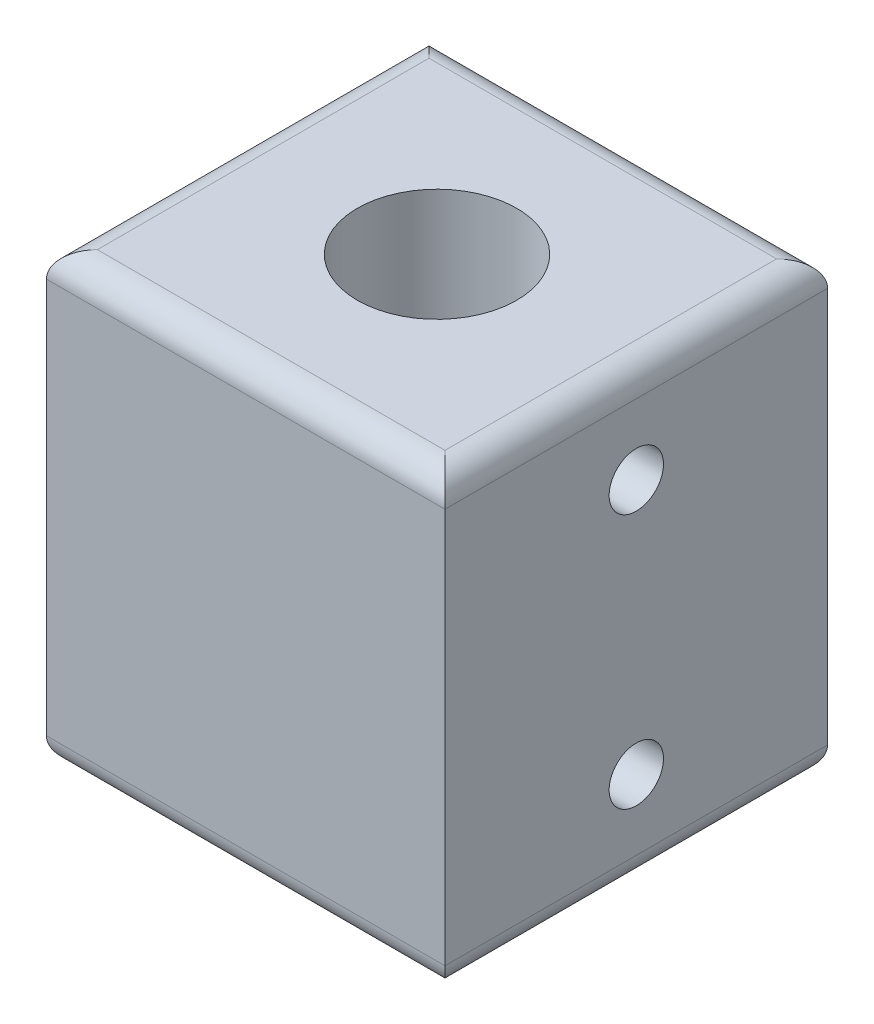
ISO-10303-21;
HEADER;
FILE_DESCRIPTION(('STEP AP214'),'2;1');
FILE_NAME('part.step','',(''),(''),'','','');
FILE_SCHEMA(('AUTOMOTIVE_DESIGN { 1 0 10303 214 1 1 1 1 }'));
ENDSEC;
DATA;
#1=APPLICATION_CONTEXT('core data for automotive mechanical design processes');
#2=APPLICATION_PROTOCOL_DEFINITION('international standard','automotive_design',2000,#1);
#3=PRODUCT_CONTEXT('',#1,'mechanical');
#4=PRODUCT('Part','Part','',(#3));
#5=PRODUCT_RELATED_PRODUCT_CATEGORY('part','',(#4));
#6=PRODUCT_DEFINITION_FORMATION('','',#4);
#7=PRODUCT_DEFINITION_CONTEXT('part definition',#1,'design');
#8=PRODUCT_DEFINITION('design','',#6,#7);
#9=PRODUCT_DEFINITION_SHAPE('','',#8);
#10=(LENGTH_UNIT() NAMED_UNIT(*) SI_UNIT(.MILLI.,.METRE.));
#11=(NAMED_UNIT(*) PLANE_ANGLE_UNIT() SI_UNIT($,.RADIAN.));
#12=(NAMED_UNIT(*) SI_UNIT($,.STERADIAN.) SOLID_ANGLE_UNIT());
#13=UNCERTAINTY_MEASURE_WITH_UNIT(LENGTH_MEASURE(1.E-05),#10,'distance_accuracy_value','');
#14=(GEOMETRIC_REPRESENTATION_CONTEXT(3) GLOBAL_UNCERTAINTY_ASSIGNED_CONTEXT((#13)) GLOBAL_UNIT_ASSIGNED_CONTEXT((#10,
#11,#12)) REPRESENTATION_CONTEXT('',''));
#15=CARTESIAN_POINT('',(0.,0.,0.));
#16=DIRECTION('',(0.,0.,1.));
#17=DIRECTION('',(1.,0.,0.));
#18=AXIS2_PLACEMENT_3D('',#15,#16,#17);
#19=CARTESIAN_POINT('',(0.,0.,19.05));
#20=DIRECTION('',(1.,0.,0.));
#21=DIRECTION('',(0.,0.,-1.));
#22=AXIS2_PLACEMENT_3D('',#19,#20,#21);
#23=PLANE('',#22);
#24=CARTESIAN_POINT('',(0.,17.4625,9.525));
#25=DIRECTION('',(-1.,0.,0.));
#26=DIRECTION('',(0.,0.,1.));
#27=AXIS2_PLACEMENT_3D('',#24,#25,#26);
#28=CIRCLE('',#27,1.35255);
#29=CARTESIAN_POINT('',(0.,17.4625,10.87755));
#30=VERTEX_POINT('',#29);
#31=EDGE_CURVE('E144',#30,#30,#28,.T.);
#32=ORIENTED_EDGE('',*,*,#31,.F.);
#33=EDGE_LOOP('',(#32));
#34=FACE_BOUND('',#33,.T.);
#35=CARTESIAN_POINT('',(0.,4.7625,9.525));
#36=DIRECTION('',(-1.,0.,0.));
#37=DIRECTION('',(0.,0.,1.));
#38=AXIS2_PLACEMENT_3D('',#35,#36,#37);
#39=CIRCLE('',#38,1.35255);
#40=CARTESIAN_POINT('',(0.,4.7625,10.87755));
#41=VERTEX_POINT('',#40);
#42=EDGE_CURVE('E150',#41,#41,#39,.T.);
#43=ORIENTED_EDGE('',*,*,#42,.F.);
#44=EDGE_LOOP('',(#43));
#45=FACE_BOUND('',#44,.T.);
#46=DIRECTION('',(0.,-1.,0.));
#47=VECTOR('',#46,1.);
#48=CARTESIAN_POINT('',(0.,0.,0.));
#49=LINE('',#48,#47);
#50=CARTESIAN_POINT('',(0.,20.955,0.));
#51=VERTEX_POINT('',#50);
#52=CARTESIAN_POINT('',(0.,1.27,0.));
#53=VERTEX_POINT('',#52);
#54=EDGE_CURVE('E160',#51,#53,#49,.T.);
#55=ORIENTED_EDGE('',*,*,#54,.T.);
#56=DIRECTION('',(0.,0.,-1.));
#57=VECTOR('',#56,1.);
#58=CARTESIAN_POINT('',(0.,1.27,19.05));
#59=LINE('',#58,#57);
#60=CARTESIAN_POINT('',(0.,1.27,19.05));
#61=VERTEX_POINT('',#60);
#62=EDGE_CURVE('E199',#53,#61,#59,.F.);
#63=ORIENTED_EDGE('',*,*,#62,.T.);
#64=DIRECTION('',(0.,-1.,0.));
#65=VECTOR('',#64,1.);
#66=CARTESIAN_POINT('',(0.,0.,19.05));
#67=LINE('',#66,#65);
#68=CARTESIAN_POINT('',(0.,20.955,19.05));
#69=VERTEX_POINT('',#68);
#70=EDGE_CURVE('E163',#69,#61,#67,.T.);
#71=ORIENTED_EDGE('',*,*,#70,.F.);
#72=DIRECTION('',(0.,0.,-1.));
#73=VECTOR('',#72,1.);
#74=CARTESIAN_POINT('',(0.,20.955,19.05));
#75=LINE('',#74,#73);
#76=EDGE_CURVE('E197',#69,#51,#75,.T.);
#77=ORIENTED_EDGE('',*,*,#76,.T.);
#78=EDGE_LOOP('',(#55,#63,#71,#77));
#79=FACE_BOUND('',#78,.T.);
#80=ADVANCED_FACE('F34',(#34,#45,#79),#23,.F.);
#81=CARTESIAN_POINT('',(0.,0.,19.05));
#82=DIRECTION('',(0.,1.,0.));
#83=DIRECTION('',(0.,0.,1.));
#84=AXIS2_PLACEMENT_3D('',#81,#82,#83);
#85=PLANE('',#84);
#86=DIRECTION('',(0.,0.,-1.));
#87=VECTOR('',#86,1.);
#88=CARTESIAN_POINT('',(1.27,0.,19.05));
#89=LINE('',#88,#87);
#90=CARTESIAN_POINT('',(1.27,0.,17.78));
#91=VERTEX_POINT('',#90);
#92=CARTESIAN_POINT('',(1.27,0.,1.27));
#93=VERTEX_POINT('',#92);
#94=EDGE_CURVE('E170',#91,#93,#89,.T.);
#95=ORIENTED_EDGE('',*,*,#94,.T.);
#96=DIRECTION('',(1.,0.,0.));
#97=VECTOR('',#96,1.);
#98=CARTESIAN_POINT('',(19.84502,0.,1.27));
#99=LINE('',#98,#97);
#100=CARTESIAN_POINT('',(18.57502,0.,1.27));
#101=VERTEX_POINT('',#100);
#102=EDGE_CURVE('E180',#93,#101,#99,.T.);
#103=ORIENTED_EDGE('',*,*,#102,.T.);
#104=DIRECTION('',(0.,0.,-1.));
#105=VECTOR('',#104,1.);
#106=CARTESIAN_POINT('',(18.57502,0.,19.05));
#107=LINE('',#106,#105);
#108=CARTESIAN_POINT('',(18.57502,0.,17.78));
#109=VERTEX_POINT('',#108);
#110=EDGE_CURVE('E178',#101,#109,#107,.F.);
#111=ORIENTED_EDGE('',*,*,#110,.T.);
#112=DIRECTION('',(1.,0.,0.));
#113=VECTOR('',#112,1.);
#114=CARTESIAN_POINT('',(0.,0.,17.78));
#115=LINE('',#114,#113);
#116=EDGE_CURVE('E176',#109,#91,#115,.F.);
#117=ORIENTED_EDGE('',*,*,#116,.T.);
#118=EDGE_LOOP('',(#95,#103,#111,#117));
#119=FACE_BOUND('',#118,.T.);
#120=CARTESIAN_POINT('',(9.92251,0.,9.525));
#121=DIRECTION('',(0.,1.,0.));
#122=DIRECTION('',(0.,0.,1.));
#123=AXIS2_PLACEMENT_3D('',#120,#121,#122);
#124=CIRCLE('',#123,3.96875000000001);
#125=CARTESIAN_POINT('',(9.92251,0.,13.49375));
#126=VERTEX_POINT('',#125);
#127=EDGE_CURVE('E157',#126,#126,#124,.T.);
#128=ORIENTED_EDGE('',*,*,#127,.T.);
#129=EDGE_LOOP('',(#128));
#130=FACE_BOUND('',#129,.T.);
#131=ADVANCED_FACE('F257',(#119,#130),#85,.F.);
#132=CARTESIAN_POINT('',(19.84502,22.225,19.05));
#133=DIRECTION('',(-1.,0.,0.));
#134=DIRECTION('',(0.,-1.,0.));
#135=AXIS2_PLACEMENT_3D('',#132,#133,#134);
#136=PLANE('',#135);
#137=CARTESIAN_POINT('',(19.84502,17.4625,9.525));
#138=DIRECTION('',(1.,0.,0.));
#139=DIRECTION('',(0.,0.,-1.));
#140=AXIS2_PLACEMENT_3D('',#137,#138,#139);
#141=CIRCLE('',#140,1.35255);
#142=CARTESIAN_POINT('',(19.84502,17.4625,8.17245));
#143=VERTEX_POINT('',#142);
#144=EDGE_CURVE('E126',#143,#143,#141,.T.);
#145=ORIENTED_EDGE('',*,*,#144,.F.);
#146=EDGE_LOOP('',(#145));
#147=FACE_BOUND('',#146,.T.);
#148=CARTESIAN_POINT('',(19.84502,4.7625,9.525));
#149=DIRECTION('',(1.,0.,0.));
#150=DIRECTION('',(0.,0.,-1.));
#151=AXIS2_PLACEMENT_3D('',#148,#149,#150);
#152=CIRCLE('',#151,1.35255);
#153=CARTESIAN_POINT('',(19.84502,4.7625,8.17245));
#154=VERTEX_POINT('',#153);
#155=EDGE_CURVE('E138',#154,#154,#152,.T.);
#156=ORIENTED_EDGE('',*,*,#155,.F.);
#157=EDGE_LOOP('',(#156));
#158=FACE_BOUND('',#157,.T.);
#159=DIRECTION('',(0.,1.,0.));
#160=VECTOR('',#159,1.);
#161=CARTESIAN_POINT('',(19.84502,22.225,19.05));
#162=LINE('',#161,#160);
#163=CARTESIAN_POINT('',(19.84502,1.27,19.05));
#164=VERTEX_POINT('',#163);
#165=CARTESIAN_POINT('',(19.84502,20.955,19.05));
#166=VERTEX_POINT('',#165);
#167=EDGE_CURVE('E166',#164,#166,#162,.T.);
#168=ORIENTED_EDGE('',*,*,#167,.F.);
#169=DIRECTION('',(0.,0.,-1.));
#170=VECTOR('',#169,1.);
#171=CARTESIAN_POINT('',(19.84502,1.27,19.05));
#172=LINE('',#171,#170);
#173=CARTESIAN_POINT('',(19.84502,1.27,0.));
#174=VERTEX_POINT('',#173);
#175=EDGE_CURVE('E191',#164,#174,#172,.T.);
#176=ORIENTED_EDGE('',*,*,#175,.T.);
#177=DIRECTION('',(0.,1.,0.));
#178=VECTOR('',#177,1.);
#179=CARTESIAN_POINT('',(19.84502,22.225,0.));
#180=LINE('',#179,#178);
#181=CARTESIAN_POINT('',(19.84502,20.955,0.));
#182=VERTEX_POINT('',#181);
#183=EDGE_CURVE('E167',#174,#182,#180,.T.);
#184=ORIENTED_EDGE('',*,*,#183,.T.);
#185=DIRECTION('',(0.,0.,-1.));
#186=VECTOR('',#185,1.);
#187=CARTESIAN_POINT('',(19.84502,20.955,19.05));
#188=LINE('',#187,#186);
#189=EDGE_CURVE('E189',#182,#166,#188,.F.);
#190=ORIENTED_EDGE('',*,*,#189,.T.);
#191=EDGE_LOOP('',(#168,#176,#184,#190));
#192=FACE_BOUND('',#191,.T.);
#193=ADVANCED_FACE('F262',(#147,#158,#192),#136,.F.);
#194=CARTESIAN_POINT('',(0.,22.225,19.05));
#195=DIRECTION('',(0.,-1.,0.));
#196=DIRECTION('',(0.,0.,-1.));
#197=AXIS2_PLACEMENT_3D('',#194,#195,#196);
#198=PLANE('',#197);
#199=DIRECTION('',(0.,0.,-1.));
#200=VECTOR('',#199,1.);
#201=CARTESIAN_POINT('',(18.57502,22.225,19.05));
#202=LINE('',#201,#200);
#203=CARTESIAN_POINT('',(18.57502,22.225,17.78));
#204=VERTEX_POINT('',#203);
#205=CARTESIAN_POINT('',(18.57502,22.225,1.27));
#206=VERTEX_POINT('',#205);
#207=EDGE_CURVE('E58',#204,#206,#202,.T.);
#208=ORIENTED_EDGE('',*,*,#207,.T.);
#209=DIRECTION('',(-1.,0.,0.));
#210=VECTOR('',#209,1.);
#211=CARTESIAN_POINT('',(0.,22.225,1.27));
#212=LINE('',#211,#210);
#213=CARTESIAN_POINT('',(1.27,22.225,1.27));
#214=VERTEX_POINT('',#213);
#215=EDGE_CURVE('E11',#206,#214,#212,.T.);
#216=ORIENTED_EDGE('',*,*,#215,.T.);
#217=DIRECTION('',(0.,0.,-1.));
#218=VECTOR('',#217,1.);
#219=CARTESIAN_POINT('',(1.27,22.225,19.05));
#220=LINE('',#219,#218);
#221=CARTESIAN_POINT('',(1.27,22.225,17.78));
#222=VERTEX_POINT('',#221);
#223=EDGE_CURVE('E43',#214,#222,#220,.F.);
#224=ORIENTED_EDGE('',*,*,#223,.T.);
#225=DIRECTION('',(-1.,0.,0.));
#226=VECTOR('',#225,1.);
#227=CARTESIAN_POINT('',(0.,22.225,17.78));
#228=LINE('',#227,#226);
#229=EDGE_CURVE('E201',#222,#204,#228,.F.);
#230=ORIENTED_EDGE('',*,*,#229,.T.);
#231=EDGE_LOOP('',(#208,#216,#224,#230));
#232=FACE_BOUND('',#231,.T.);
#233=CARTESIAN_POINT('',(9.92251,22.225,9.525));
#234=DIRECTION('',(0.,1.,0.));
#235=DIRECTION('',(0.,0.,1.));
#236=AXIS2_PLACEMENT_3D('',#233,#234,#235);
#237=CIRCLE('',#236,3.96875000000001);
#238=CARTESIAN_POINT('',(9.92251,22.225,13.49375));
#239=VERTEX_POINT('',#238);
#240=EDGE_CURVE('E156',#239,#239,#237,.T.);
#241=ORIENTED_EDGE('',*,*,#240,.F.);
#242=EDGE_LOOP('',(#241));
#243=FACE_BOUND('',#242,.T.);
#244=ADVANCED_FACE('F264',(#232,#243),#198,.F.);
#245=CARTESIAN_POINT('',(0.,22.225,19.05));
#246=DIRECTION('',(0.,0.,-1.));
#247=DIRECTION('',(-1.,0.,0.));
#248=AXIS2_PLACEMENT_3D('',#245,#246,#247);
#249=PLANE('',#248);
#250=ORIENTED_EDGE('',*,*,#70,.T.);
#251=DIRECTION('',(1.,0.,0.));
#252=VECTOR('',#251,1.);
#253=CARTESIAN_POINT('',(0.,1.27,19.05));
#254=LINE('',#253,#252);
#255=EDGE_CURVE('E195',#61,#164,#254,.T.);
#256=ORIENTED_EDGE('',*,*,#255,.T.);
#257=ORIENTED_EDGE('',*,*,#167,.T.);
#258=DIRECTION('',(-1.,0.,0.));
#259=VECTOR('',#258,1.);
#260=CARTESIAN_POINT('',(0.,20.955,19.05));
#261=LINE('',#260,#259);
#262=EDGE_CURVE('E193',#166,#69,#261,.T.);
#263=ORIENTED_EDGE('',*,*,#262,.T.);
#264=EDGE_LOOP('',(#250,#256,#257,#263));
#265=FACE_BOUND('',#264,.T.);
#266=ADVANCED_FACE('F231',(#265),#249,.F.);
#267=CARTESIAN_POINT('',(0.,22.225,0.));
#268=DIRECTION('',(0.,0.,-1.));
#269=DIRECTION('',(-1.,0.,0.));
#270=AXIS2_PLACEMENT_3D('',#267,#268,#269);
#271=PLANE('',#270);
#272=CARTESIAN_POINT('',(9.92251,17.225,0.));
#273=DIRECTION('',(0.,0.,-1.));
#274=DIRECTION('',(-1.,0.,0.));
#275=AXIS2_PLACEMENT_3D('',#272,#273,#274);
#276=CIRCLE('',#275,1.35254999999999);
#277=CARTESIAN_POINT('',(8.56996000000001,17.225,0.));
#278=VERTEX_POINT('',#277);
#279=EDGE_CURVE('E127',#278,#278,#276,.T.);
#280=ORIENTED_EDGE('',*,*,#279,.F.);
#281=EDGE_LOOP('',(#280));
#282=FACE_BOUND('',#281,.T.);
#283=ORIENTED_EDGE('',*,*,#183,.F.);
#284=DIRECTION('',(1.,0.,0.));
#285=VECTOR('',#284,1.);
#286=CARTESIAN_POINT('',(0.,1.27,0.));
#287=LINE('',#286,#285);
#288=EDGE_CURVE('E186',#174,#53,#287,.F.);
#289=ORIENTED_EDGE('',*,*,#288,.T.);
#290=ORIENTED_EDGE('',*,*,#54,.F.);
#291=DIRECTION('',(-1.,0.,0.));
#292=VECTOR('',#291,1.);
#293=CARTESIAN_POINT('',(19.84502,20.955,0.));
#294=LINE('',#293,#292);
#295=EDGE_CURVE('E183',#51,#182,#294,.F.);
#296=ORIENTED_EDGE('',*,*,#295,.T.);
#297=EDGE_LOOP('',(#283,#289,#290,#296));
#298=FACE_BOUND('',#297,.T.);
#299=ADVANCED_FACE('F246',(#282,#298),#271,.T.);
#300=CARTESIAN_POINT('',(9.92251,0.,9.525));
#301=DIRECTION('',(0.,1.,0.));
#302=DIRECTION('',(0.,0.,1.));
#303=AXIS2_PLACEMENT_3D('',#300,#301,#302);
#304=CYLINDRICAL_SURFACE('',#303,3.96875000000001);
#305=ORIENTED_EDGE('',*,*,#127,.F.);
#306=EDGE_LOOP('',(#305));
#307=FACE_BOUND('',#306,.T.);
#308=ORIENTED_EDGE('',*,*,#240,.T.);
#309=EDGE_LOOP('',(#308));
#310=FACE_BOUND('',#309,.T.);
#311=ADVANCED_FACE('F391',(#307,#310),#304,.F.);
#312=CARTESIAN_POINT('',(4.7625,4.7625,9.525));
#313=DIRECTION('',(-1.,0.,0.));
#314=DIRECTION('',(0.,0.,1.));
#315=AXIS2_PLACEMENT_3D('',#312,#313,#314);
#316=CONICAL_SURFACE('',#315,1.35255,1.02974425867665);
#317=CARTESIAN_POINT('',(5.57519403026573,4.7625,9.525));
#318=VERTEX_POINT('',#317);
#319=VERTEX_LOOP('',#318);
#320=FACE_BOUND('',#319,.T.);
#321=CARTESIAN_POINT('',(4.7625,4.7625,9.525));
#322=DIRECTION('',(-1.,0.,0.));
#323=DIRECTION('',(0.,0.,1.));
#324=AXIS2_PLACEMENT_3D('',#321,#322,#323);
#325=CIRCLE('',#324,1.35255);
#326=CARTESIAN_POINT('',(4.7625,4.7625,10.87755));
#327=VERTEX_POINT('',#326);
#328=EDGE_CURVE('E153',#327,#327,#325,.T.);
#329=ORIENTED_EDGE('',*,*,#328,.T.);
#330=EDGE_LOOP('',(#329));
#331=FACE_BOUND('',#330,.T.);
#332=ADVANCED_FACE('F384',(#320,#331),#316,.F.);
#333=CARTESIAN_POINT('',(0.,4.7625,9.525));
#334=DIRECTION('',(-1.,0.,0.));
#335=DIRECTION('',(0.,0.,1.));
#336=AXIS2_PLACEMENT_3D('',#333,#334,#335);
#337=CYLINDRICAL_SURFACE('',#336,1.35255);
#338=ORIENTED_EDGE('',*,*,#328,.F.);
#339=EDGE_LOOP('',(#338));
#340=FACE_BOUND('',#339,.T.);
#341=ORIENTED_EDGE('',*,*,#42,.T.);
#342=EDGE_LOOP('',(#341));
#343=FACE_BOUND('',#342,.T.);
#344=ADVANCED_FACE('F376',(#340,#343),#337,.F.);
#345=CARTESIAN_POINT('',(4.7625,17.4625,9.525));
#346=DIRECTION('',(-1.,0.,0.));
#347=DIRECTION('',(0.,0.,1.));
#348=AXIS2_PLACEMENT_3D('',#345,#346,#347);
#349=CONICAL_SURFACE('',#348,1.35255,1.02974425867665);
#350=CARTESIAN_POINT('',(5.57519403026573,17.4625,9.525));
#351=VERTEX_POINT('',#350);
#352=VERTEX_LOOP('',#351);
#353=FACE_BOUND('',#352,.T.);
#354=CARTESIAN_POINT('',(4.7625,17.4625,9.525));
#355=DIRECTION('',(-1.,0.,0.));
#356=DIRECTION('',(0.,0.,1.));
#357=AXIS2_PLACEMENT_3D('',#354,#355,#356);
#358=CIRCLE('',#357,1.35255);
#359=CARTESIAN_POINT('',(4.7625,17.4625,10.87755));
#360=VERTEX_POINT('',#359);
#361=EDGE_CURVE('E147',#360,#360,#358,.T.);
#362=ORIENTED_EDGE('',*,*,#361,.T.);
#363=EDGE_LOOP('',(#362));
#364=FACE_BOUND('',#363,.T.);
#365=ADVANCED_FACE('F369',(#353,#364),#349,.F.);
#366=CARTESIAN_POINT('',(0.,17.4625,9.525));
#367=DIRECTION('',(-1.,0.,0.));
#368=DIRECTION('',(0.,0.,1.));
#369=AXIS2_PLACEMENT_3D('',#366,#367,#368);
#370=CYLINDRICAL_SURFACE('',#369,1.35255);
#371=ORIENTED_EDGE('',*,*,#361,.F.);
#372=EDGE_LOOP('',(#371));
#373=FACE_BOUND('',#372,.T.);
#374=ORIENTED_EDGE('',*,*,#31,.T.);
#375=EDGE_LOOP('',(#374));
#376=FACE_BOUND('',#375,.T.);
#377=ADVANCED_FACE('F360',(#373,#376),#370,.F.);
#378=CARTESIAN_POINT('',(15.08252,4.7625,9.525));
#379=DIRECTION('',(1.,0.,0.));
#380=DIRECTION('',(0.,0.,-1.));
#381=AXIS2_PLACEMENT_3D('',#378,#379,#380);
#382=CONICAL_SURFACE('',#381,1.35255,1.02974425867665);
#383=CARTESIAN_POINT('',(14.2698259697343,4.7625,9.525));
#384=VERTEX_POINT('',#383);
#385=VERTEX_LOOP('',#384);
#386=FACE_BOUND('',#385,.T.);
#387=CARTESIAN_POINT('',(15.08252,4.7625,9.525));
#388=DIRECTION('',(1.,0.,0.));
#389=DIRECTION('',(0.,0.,-1.));
#390=AXIS2_PLACEMENT_3D('',#387,#388,#389);
#391=CIRCLE('',#390,1.35255);
#392=CARTESIAN_POINT('',(15.08252,4.7625,8.17245));
#393=VERTEX_POINT('',#392);
#394=EDGE_CURVE('E141',#393,#393,#391,.T.);
#395=ORIENTED_EDGE('',*,*,#394,.T.);
#396=EDGE_LOOP('',(#395));
#397=FACE_BOUND('',#396,.T.);
#398=ADVANCED_FACE('F353',(#386,#397),#382,.F.);
#399=CARTESIAN_POINT('',(19.84502,4.7625,9.525));
#400=DIRECTION('',(1.,0.,0.));
#401=DIRECTION('',(0.,0.,-1.));
#402=AXIS2_PLACEMENT_3D('',#399,#400,#401);
#403=CYLINDRICAL_SURFACE('',#402,1.35255);
#404=ORIENTED_EDGE('',*,*,#394,.F.);
#405=EDGE_LOOP('',(#404));
#406=FACE_BOUND('',#405,.T.);
#407=ORIENTED_EDGE('',*,*,#155,.T.);
#408=EDGE_LOOP('',(#407));
#409=FACE_BOUND('',#408,.T.);
#410=ADVANCED_FACE('F345',(#406,#409),#403,.F.);
#411=CARTESIAN_POINT('',(15.08252,17.4625,9.525));
#412=DIRECTION('',(1.,0.,0.));
#413=DIRECTION('',(0.,0.,-1.));
#414=AXIS2_PLACEMENT_3D('',#411,#412,#413);
#415=CONICAL_SURFACE('',#414,1.35255,1.02974425867665);
#416=CARTESIAN_POINT('',(14.2698259697343,17.4625,9.525));
#417=VERTEX_POINT('',#416);
#418=VERTEX_LOOP('',#417);
#419=FACE_BOUND('',#418,.T.);
#420=CARTESIAN_POINT('',(15.08252,17.4625,9.525));
#421=DIRECTION('',(1.,0.,0.));
#422=DIRECTION('',(0.,0.,-1.));
#423=AXIS2_PLACEMENT_3D('',#420,#421,#422);
#424=CIRCLE('',#423,1.35255);
#425=CARTESIAN_POINT('',(15.08252,17.4625,8.17245));
#426=VERTEX_POINT('',#425);
#427=EDGE_CURVE('E130',#426,#426,#424,.T.);
#428=ORIENTED_EDGE('',*,*,#427,.T.);
#429=EDGE_LOOP('',(#428));
#430=FACE_BOUND('',#429,.T.);
#431=ADVANCED_FACE('F337',(#419,#430),#415,.F.);
#432=CARTESIAN_POINT('',(19.84502,17.4625,9.525));
#433=DIRECTION('',(1.,0.,0.));
#434=DIRECTION('',(0.,0.,-1.));
#435=AXIS2_PLACEMENT_3D('',#432,#433,#434);
#436=CYLINDRICAL_SURFACE('',#435,1.35255);
#437=ORIENTED_EDGE('',*,*,#427,.F.);
#438=EDGE_LOOP('',(#437));
#439=FACE_BOUND('',#438,.T.);
#440=ORIENTED_EDGE('',*,*,#144,.T.);
#441=EDGE_LOOP('',(#440));
#442=FACE_BOUND('',#441,.T.);
#443=ADVANCED_FACE('F120',(#439,#442),#436,.F.);
#444=CARTESIAN_POINT('',(9.92251,17.225,3.81));
#445=DIRECTION('',(0.,0.,-1.));
#446=DIRECTION('',(-1.,0.,0.));
#447=AXIS2_PLACEMENT_3D('',#444,#445,#446);
#448=CONICAL_SURFACE('',#447,1.35255,1.02974425867665);
#449=CARTESIAN_POINT('',(9.92251,17.225,4.62269403026573));
#450=VERTEX_POINT('',#449);
#451=VERTEX_LOOP('',#450);
#452=FACE_BOUND('',#451,.T.);
#453=CARTESIAN_POINT('',(9.92251,17.225,3.81));
#454=DIRECTION('',(0.,0.,-1.));
#455=DIRECTION('',(-1.,0.,0.));
#456=AXIS2_PLACEMENT_3D('',#453,#454,#455);
#457=CIRCLE('',#456,1.35255);
#458=CARTESIAN_POINT('',(8.56996000000001,17.225,3.81));
#459=VERTEX_POINT('',#458);
#460=EDGE_CURVE('E124',#459,#459,#457,.T.);
#461=ORIENTED_EDGE('',*,*,#460,.T.);
#462=EDGE_LOOP('',(#461));
#463=FACE_BOUND('',#462,.T.);
#464=ADVANCED_FACE('F116',(#452,#463),#448,.F.);
#465=CARTESIAN_POINT('',(9.92251,17.225,0.));
#466=DIRECTION('',(0.,0.,-1.));
#467=DIRECTION('',(-1.,0.,0.));
#468=AXIS2_PLACEMENT_3D('',#465,#466,#467);
#469=CYLINDRICAL_SURFACE('',#468,1.35254999999999);
#470=ORIENTED_EDGE('',*,*,#460,.F.);
#471=EDGE_LOOP('',(#470));
#472=FACE_BOUND('',#471,.T.);
#473=ORIENTED_EDGE('',*,*,#279,.T.);
#474=EDGE_LOOP('',(#473));
#475=FACE_BOUND('',#474,.T.);
#476=ADVANCED_FACE('F119',(#472,#475),#469,.F.);
#477=CARTESIAN_POINT('',(0.,1.27,17.78));
#478=DIRECTION('',(1.,0.,0.));
#479=DIRECTION('',(0.,0.,-1.));
#480=AXIS2_PLACEMENT_3D('',#477,#478,#479);
#481=CYLINDRICAL_SURFACE('',#480,1.27);
#482=CARTESIAN_POINT('',(18.57502,1.27,17.78));
#483=DIRECTION('',(0.707106781186547,0.,-0.707106781186547));
#484=DIRECTION('',(0.707106781186547,0.,0.707106781186547));
#485=AXIS2_PLACEMENT_3D('',#482,#483,#484);
#486=ELLIPSE('',#485,1.79605122421383,1.27);
#487=EDGE_CURVE('E209',#164,#109,#486,.T.);
#488=ORIENTED_EDGE('',*,*,#487,.F.);
#489=ORIENTED_EDGE('',*,*,#255,.F.);
#490=CARTESIAN_POINT('',(1.27,1.27,17.78));
#491=DIRECTION('',(-0.707106781186547,0.,-0.707106781186547));
#492=DIRECTION('',(0.707106781186547,0.,-0.707106781186547));
#493=AXIS2_PLACEMENT_3D('',#490,#491,#492);
#494=ELLIPSE('',#493,1.79605122421383,1.27);
#495=EDGE_CURVE('E133',#91,#61,#494,.T.);
#496=ORIENTED_EDGE('',*,*,#495,.F.);
#497=ORIENTED_EDGE('',*,*,#116,.F.);
#498=EDGE_LOOP('',(#488,#489,#496,#497));
#499=FACE_BOUND('',#498,.T.);
#500=ADVANCED_FACE('F260',(#499),#481,.T.);
#501=CARTESIAN_POINT('',(1.27,1.27,19.05));
#502=DIRECTION('',(0.,0.,-1.));
#503=DIRECTION('',(-1.,0.,0.));
#504=AXIS2_PLACEMENT_3D('',#501,#502,#503);
#505=CYLINDRICAL_SURFACE('',#504,1.27);
#506=ORIENTED_EDGE('',*,*,#495,.T.);
#507=ORIENTED_EDGE('',*,*,#62,.F.);
#508=CARTESIAN_POINT('',(1.27,1.27,1.27));
#509=DIRECTION('',(0.707106781186547,0.,-0.707106781186547));
#510=DIRECTION('',(-0.707106781186547,0.,-0.707106781186547));
#511=AXIS2_PLACEMENT_3D('',#508,#509,#510);
#512=ELLIPSE('',#511,1.79605122421383,1.27);
#513=EDGE_CURVE('E207',#93,#53,#512,.T.);
#514=ORIENTED_EDGE('',*,*,#513,.F.);
#515=ORIENTED_EDGE('',*,*,#94,.F.);
#516=EDGE_LOOP('',(#506,#507,#514,#515));
#517=FACE_BOUND('',#516,.T.);
#518=ADVANCED_FACE('F239',(#517),#505,.T.);
#519=CARTESIAN_POINT('',(18.57502,1.27,19.05));
#520=DIRECTION('',(0.,0.,-1.));
#521=DIRECTION('',(-1.,0.,0.));
#522=AXIS2_PLACEMENT_3D('',#519,#520,#521);
#523=CYLINDRICAL_SURFACE('',#522,1.27);
#524=ORIENTED_EDGE('',*,*,#487,.T.);
#525=ORIENTED_EDGE('',*,*,#110,.F.);
#526=CARTESIAN_POINT('',(18.57502,1.27,1.27));
#527=DIRECTION('',(-0.707106781186547,0.,-0.707106781186547));
#528=DIRECTION('',(0.707106781186547,0.,-0.707106781186547));
#529=AXIS2_PLACEMENT_3D('',#526,#527,#528);
#530=ELLIPSE('',#529,1.79605122421383,1.27);
#531=EDGE_CURVE('E205',#174,#101,#530,.T.);
#532=ORIENTED_EDGE('',*,*,#531,.F.);
#533=ORIENTED_EDGE('',*,*,#175,.F.);
#534=EDGE_LOOP('',(#524,#525,#532,#533));
#535=FACE_BOUND('',#534,.T.);
#536=ADVANCED_FACE('F253',(#535),#523,.T.);
#537=CARTESIAN_POINT('',(0.,1.27,1.27));
#538=DIRECTION('',(-1.,0.,0.));
#539=DIRECTION('',(0.,0.,1.));
#540=AXIS2_PLACEMENT_3D('',#537,#538,#539);
#541=CYLINDRICAL_SURFACE('',#540,1.27);
#542=ORIENTED_EDGE('',*,*,#513,.T.);
#543=ORIENTED_EDGE('',*,*,#288,.F.);
#544=ORIENTED_EDGE('',*,*,#531,.T.);
#545=ORIENTED_EDGE('',*,*,#102,.F.);
#546=EDGE_LOOP('',(#542,#543,#544,#545));
#547=FACE_BOUND('',#546,.T.);
#548=ADVANCED_FACE('F249',(#547),#541,.T.);
#549=CARTESIAN_POINT('',(0.,20.955,17.78));
#550=DIRECTION('',(-1.,0.,0.));
#551=DIRECTION('',(0.,0.,1.));
#552=AXIS2_PLACEMENT_3D('',#549,#550,#551);
#553=CYLINDRICAL_SURFACE('',#552,1.27);
#554=CARTESIAN_POINT('',(1.27,20.955,17.78));
#555=DIRECTION('',(-0.707106781186547,0.,-0.707106781186547));
#556=DIRECTION('',(-0.707106781186547,0.,0.707106781186547));
#557=AXIS2_PLACEMENT_3D('',#554,#555,#556);
#558=ELLIPSE('',#557,1.79605122421383,1.27);
#559=EDGE_CURVE('E216',#69,#222,#558,.T.);
#560=ORIENTED_EDGE('',*,*,#559,.F.);
#561=ORIENTED_EDGE('',*,*,#262,.F.);
#562=CARTESIAN_POINT('',(18.57502,20.955,17.78));
#563=DIRECTION('',(-0.707106781186547,0.,0.707106781186547));
#564=DIRECTION('',(-0.707106781186547,0.,-0.707106781186547));
#565=AXIS2_PLACEMENT_3D('',#562,#563,#564);
#566=ELLIPSE('',#565,1.79605122421383,1.27);
#567=EDGE_CURVE('E38',#204,#166,#566,.F.);
#568=ORIENTED_EDGE('',*,*,#567,.F.);
#569=ORIENTED_EDGE('',*,*,#229,.F.);
#570=EDGE_LOOP('',(#560,#561,#568,#569));
#571=FACE_BOUND('',#570,.T.);
#572=ADVANCED_FACE('F36',(#571),#553,.T.);
#573=CARTESIAN_POINT('',(18.57502,20.955,19.05));
#574=DIRECTION('',(0.,0.,-1.));
#575=DIRECTION('',(-1.,0.,0.));
#576=AXIS2_PLACEMENT_3D('',#573,#574,#575);
#577=CYLINDRICAL_SURFACE('',#576,1.27);
#578=ORIENTED_EDGE('',*,*,#567,.T.);
#579=ORIENTED_EDGE('',*,*,#189,.F.);
#580=CARTESIAN_POINT('',(18.57502,20.955,1.27));
#581=DIRECTION('',(-0.707106781186547,0.,-0.707106781186547));
#582=DIRECTION('',(0.707106781186547,0.,-0.707106781186547));
#583=AXIS2_PLACEMENT_3D('',#580,#581,#582);
#584=ELLIPSE('',#583,1.79605122421383,1.27);
#585=EDGE_CURVE('E215',#206,#182,#584,.T.);
#586=ORIENTED_EDGE('',*,*,#585,.F.);
#587=ORIENTED_EDGE('',*,*,#207,.F.);
#588=EDGE_LOOP('',(#578,#579,#586,#587));
#589=FACE_BOUND('',#588,.T.);
#590=ADVANCED_FACE('F225',(#589),#577,.T.);
#591=CARTESIAN_POINT('',(1.27,20.955,19.05));
#592=DIRECTION('',(0.,0.,-1.));
#593=DIRECTION('',(-1.,0.,0.));
#594=AXIS2_PLACEMENT_3D('',#591,#592,#593);
#595=CYLINDRICAL_SURFACE('',#594,1.27);
#596=ORIENTED_EDGE('',*,*,#559,.T.);
#597=ORIENTED_EDGE('',*,*,#223,.F.);
#598=CARTESIAN_POINT('',(1.27,20.955,1.27));
#599=DIRECTION('',(0.707106781186547,0.,-0.707106781186547));
#600=DIRECTION('',(-0.707106781186547,0.,-0.707106781186547));
#601=AXIS2_PLACEMENT_3D('',#598,#599,#600);
#602=ELLIPSE('',#601,1.79605122421383,1.27);
#603=EDGE_CURVE('E51',#51,#214,#602,.T.);
#604=ORIENTED_EDGE('',*,*,#603,.F.);
#605=ORIENTED_EDGE('',*,*,#76,.F.);
#606=EDGE_LOOP('',(#596,#597,#604,#605));
#607=FACE_BOUND('',#606,.T.);
#608=ADVANCED_FACE('F294',(#607),#595,.T.);
#609=CARTESIAN_POINT('',(0.,20.955,1.27));
#610=DIRECTION('',(1.,0.,0.));
#611=DIRECTION('',(0.,0.,-1.));
#612=AXIS2_PLACEMENT_3D('',#609,#610,#611);
#613=CYLINDRICAL_SURFACE('',#612,1.27);
#614=ORIENTED_EDGE('',*,*,#585,.T.);
#615=ORIENTED_EDGE('',*,*,#295,.F.);
#616=ORIENTED_EDGE('',*,*,#603,.T.);
#617=ORIENTED_EDGE('',*,*,#215,.F.);
#618=EDGE_LOOP('',(#614,#615,#616,#617));
#619=FACE_BOUND('',#618,.T.);
#620=ADVANCED_FACE('F291',(#619),#613,.T.);
#621=CLOSED_SHELL('',(#80,#131,#193,#244,#266,#299,#311,#332,#344,#365,#377,#398,#410,#431,#443,
#464,#476,#500,#518,#536,#548,#572,#590,#608,#620));
#622=MANIFOLD_SOLID_BREP('B2',#621);
#623=ADVANCED_BREP_SHAPE_REPRESENTATION('',(#18,#622),#14);
#624=SHAPE_DEFINITION_REPRESENTATION(#9,#623);
ENDSEC;
END-ISO-10303-21;
